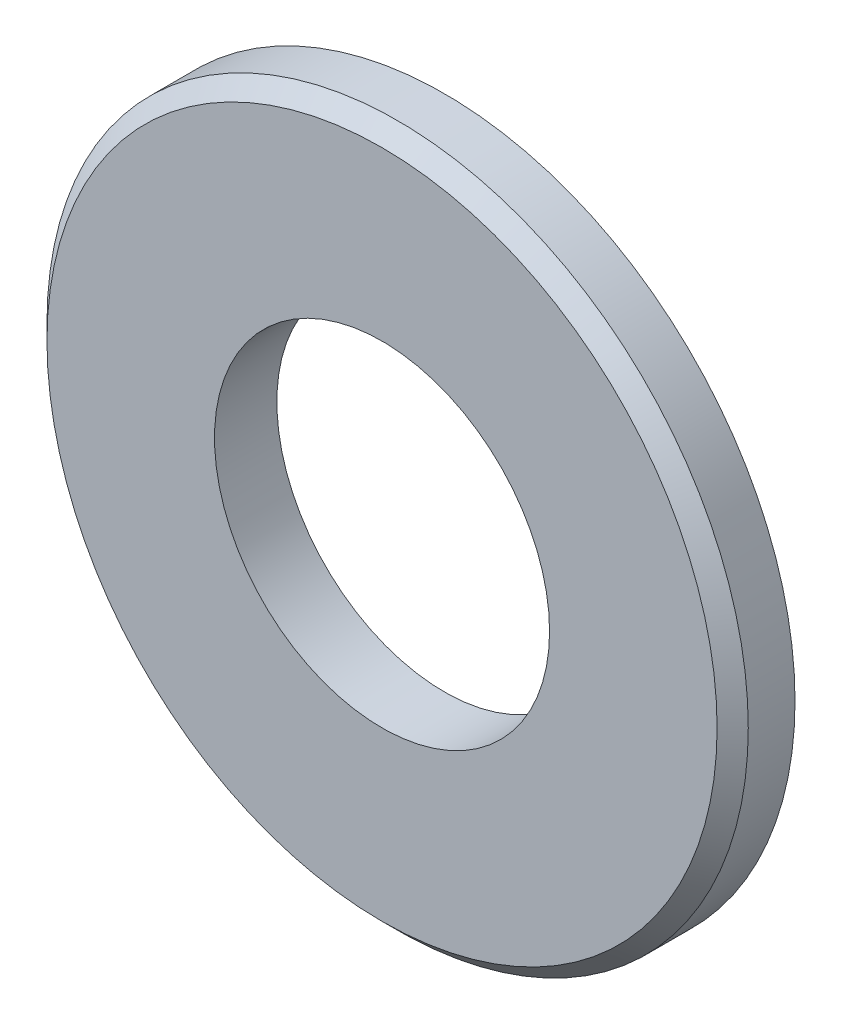
ISO-10303-21;
HEADER;
FILE_DESCRIPTION(('STEP AP214'),'2;1');
FILE_NAME('part.step','',(''),(''),'','','');
FILE_SCHEMA(('AUTOMOTIVE_DESIGN { 1 0 10303 214 1 1 1 1 }'));
ENDSEC;
DATA;
#1=APPLICATION_CONTEXT('core data for automotive mechanical design processes');
#2=APPLICATION_PROTOCOL_DEFINITION('international standard','automotive_design',2000,#1);
#3=PRODUCT_CONTEXT('',#1,'mechanical');
#4=PRODUCT('Part','Part','',(#3));
#5=PRODUCT_RELATED_PRODUCT_CATEGORY('part','',(#4));
#6=PRODUCT_DEFINITION_FORMATION('','',#4);
#7=PRODUCT_DEFINITION_CONTEXT('part definition',#1,'design');
#8=PRODUCT_DEFINITION('design','',#6,#7);
#9=PRODUCT_DEFINITION_SHAPE('','',#8);
#10=(LENGTH_UNIT() NAMED_UNIT(*) SI_UNIT(.MILLI.,.METRE.));
#11=(NAMED_UNIT(*) PLANE_ANGLE_UNIT() SI_UNIT($,.RADIAN.));
#12=(NAMED_UNIT(*) SI_UNIT($,.STERADIAN.) SOLID_ANGLE_UNIT());
#13=UNCERTAINTY_MEASURE_WITH_UNIT(LENGTH_MEASURE(1.E-05),#10,'distance_accuracy_value','');
#14=(GEOMETRIC_REPRESENTATION_CONTEXT(3) GLOBAL_UNCERTAINTY_ASSIGNED_CONTEXT((#13)) GLOBAL_UNIT_ASSIGNED_CONTEXT((#10,
#11,#12)) REPRESENTATION_CONTEXT('',''));
#15=CARTESIAN_POINT('',(0.,0.,0.));
#16=DIRECTION('',(0.,0.,1.));
#17=DIRECTION('',(1.,0.,0.));
#18=AXIS2_PLACEMENT_3D('',#15,#16,#17);
#19=CARTESIAN_POINT('',(0.,0.,-0.8));
#20=DIRECTION('',(0.,0.,1.));
#21=DIRECTION('',(1.,0.,0.));
#22=AXIS2_PLACEMENT_3D('',#19,#20,#21);
#23=CYLINDRICAL_SURFACE('',#22,4.5);
#24=CARTESIAN_POINT('',(0.,0.,-0.200000000000001));
#25=DIRECTION('',(0.,0.,1.));
#26=DIRECTION('',(1.,0.,0.));
#27=AXIS2_PLACEMENT_3D('',#24,#25,#26);
#28=CIRCLE('',#27,4.5);
#29=CARTESIAN_POINT('',(4.5,0.,-0.200000000000001));
#30=VERTEX_POINT('',#29);
#31=EDGE_CURVE('E10',#30,#30,#28,.F.);
#32=ORIENTED_EDGE('',*,*,#31,.T.);
#33=EDGE_LOOP('',(#32));
#34=FACE_BOUND('',#33,.T.);
#35=CARTESIAN_POINT('',(0.,0.,-0.8));
#36=DIRECTION('',(0.,0.,1.));
#37=DIRECTION('',(1.,0.,0.));
#38=AXIS2_PLACEMENT_3D('',#35,#36,#37);
#39=CIRCLE('',#38,4.5);
#40=CARTESIAN_POINT('',(4.5,0.,-0.8));
#41=VERTEX_POINT('',#40);
#42=EDGE_CURVE('E41',#41,#41,#39,.T.);
#43=ORIENTED_EDGE('',*,*,#42,.T.);
#44=EDGE_LOOP('',(#43));
#45=FACE_BOUND('',#44,.T.);
#46=ADVANCED_FACE('F30',(#34,#45),#23,.T.);
#47=CARTESIAN_POINT('',(0.,0.,-0.8));
#48=DIRECTION('',(0.,0.,1.));
#49=DIRECTION('',(1.,0.,0.));
#50=AXIS2_PLACEMENT_3D('',#47,#48,#49);
#51=PLANE('',#50);
#52=CARTESIAN_POINT('',(0.,0.,-0.8));
#53=DIRECTION('',(0.,0.,1.));
#54=DIRECTION('',(1.,0.,0.));
#55=AXIS2_PLACEMENT_3D('',#52,#53,#54);
#56=CIRCLE('',#55,2.15);
#57=CARTESIAN_POINT('',(2.15,0.,-0.8));
#58=VERTEX_POINT('',#57);
#59=EDGE_CURVE('E45',#58,#58,#56,.T.);
#60=ORIENTED_EDGE('',*,*,#59,.T.);
#61=EDGE_LOOP('',(#60));
#62=FACE_BOUND('',#61,.T.);
#63=ORIENTED_EDGE('',*,*,#42,.F.);
#64=EDGE_LOOP('',(#63));
#65=FACE_BOUND('',#64,.T.);
#66=ADVANCED_FACE('F54',(#62,#65),#51,.F.);
#67=CARTESIAN_POINT('',(0.,0.,0.));
#68=DIRECTION('',(0.,0.,1.));
#69=DIRECTION('',(1.,0.,0.));
#70=AXIS2_PLACEMENT_3D('',#67,#68,#69);
#71=PLANE('',#70);
#72=CARTESIAN_POINT('',(0.,0.,0.));
#73=DIRECTION('',(0.,0.,1.));
#74=DIRECTION('',(1.,0.,0.));
#75=AXIS2_PLACEMENT_3D('',#72,#73,#74);
#76=CIRCLE('',#75,4.3);
#77=CARTESIAN_POINT('',(4.3,0.,0.));
#78=VERTEX_POINT('',#77);
#79=EDGE_CURVE('E37',#78,#78,#76,.T.);
#80=ORIENTED_EDGE('',*,*,#79,.T.);
#81=EDGE_LOOP('',(#80));
#82=FACE_BOUND('',#81,.T.);
#83=CARTESIAN_POINT('',(0.,0.,0.));
#84=DIRECTION('',(0.,0.,1.));
#85=DIRECTION('',(1.,0.,0.));
#86=AXIS2_PLACEMENT_3D('',#83,#84,#85);
#87=CIRCLE('',#86,2.15);
#88=CARTESIAN_POINT('',(2.15,0.,0.));
#89=VERTEX_POINT('',#88);
#90=EDGE_CURVE('E48',#89,#89,#87,.T.);
#91=ORIENTED_EDGE('',*,*,#90,.F.);
#92=EDGE_LOOP('',(#91));
#93=FACE_BOUND('',#92,.T.);
#94=ADVANCED_FACE('F60',(#82,#93),#71,.T.);
#95=CARTESIAN_POINT('',(0.,0.,-0.8));
#96=DIRECTION('',(0.,0.,1.));
#97=DIRECTION('',(1.,0.,0.));
#98=AXIS2_PLACEMENT_3D('',#95,#96,#97);
#99=CYLINDRICAL_SURFACE('',#98,2.15);
#100=ORIENTED_EDGE('',*,*,#59,.F.);
#101=EDGE_LOOP('',(#100));
#102=FACE_BOUND('',#101,.T.);
#103=ORIENTED_EDGE('',*,*,#90,.T.);
#104=EDGE_LOOP('',(#103));
#105=FACE_BOUND('',#104,.T.);
#106=ADVANCED_FACE('F57',(#102,#105),#99,.F.);
#107=CARTESIAN_POINT('',(0.,0.,0.));
#108=DIRECTION('',(0.,0.,-1.));
#109=DIRECTION('',(-1.,0.,0.));
#110=AXIS2_PLACEMENT_3D('',#107,#108,#109);
#111=CONICAL_SURFACE('',#110,4.3,0.785398163397444);
#112=ORIENTED_EDGE('',*,*,#31,.F.);
#113=EDGE_LOOP('',(#112));
#114=FACE_BOUND('',#113,.T.);
#115=ORIENTED_EDGE('',*,*,#79,.F.);
#116=EDGE_LOOP('',(#115));
#117=FACE_BOUND('',#116,.T.);
#118=ADVANCED_FACE('F32',(#114,#117),#111,.T.);
#119=CLOSED_SHELL('',(#46,#66,#94,#106,#118));
#120=MANIFOLD_SOLID_BREP('B2',#119);
#121=ADVANCED_BREP_SHAPE_REPRESENTATION('',(#18,#120),#14);
#122=SHAPE_DEFINITION_REPRESENTATION(#9,#121);
ENDSEC;
END-ISO-10303-21;
